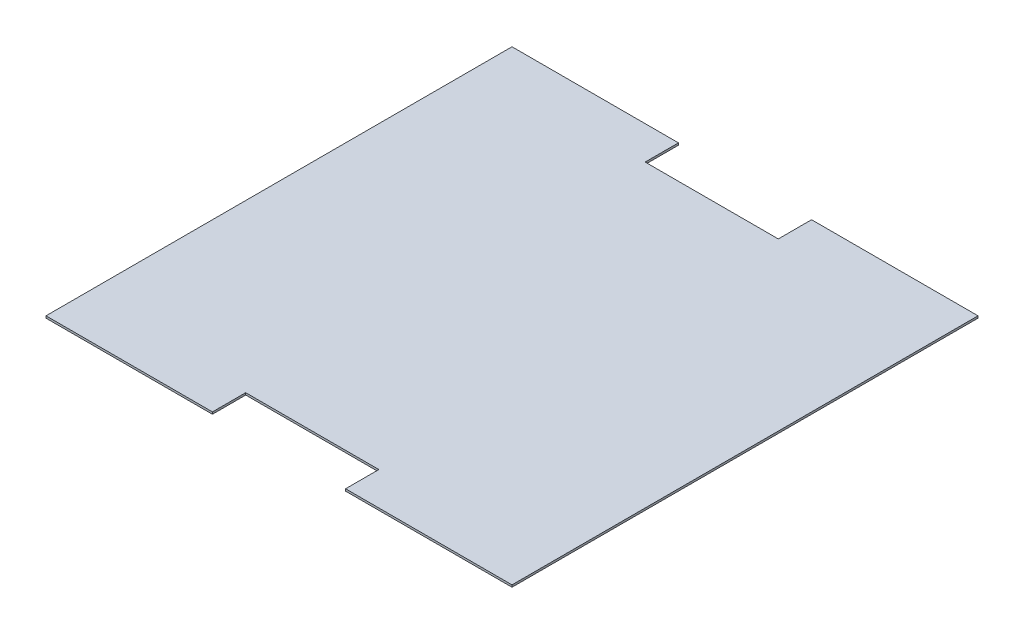
ISO-10303-21;
HEADER;
FILE_DESCRIPTION(('STEP AP214'),'2;1');
FILE_NAME('part.step','',(''),(''),'','','');
FILE_SCHEMA(('AUTOMOTIVE_DESIGN { 1 0 10303 214 1 1 1 1 }'));
ENDSEC;
DATA;
#1=APPLICATION_CONTEXT('core data for automotive mechanical design processes');
#2=APPLICATION_PROTOCOL_DEFINITION('international standard','automotive_design',2000,#1);
#3=PRODUCT_CONTEXT('',#1,'mechanical');
#4=PRODUCT('Part','Part','',(#3));
#5=PRODUCT_RELATED_PRODUCT_CATEGORY('part','',(#4));
#6=PRODUCT_DEFINITION_FORMATION('','',#4);
#7=PRODUCT_DEFINITION_CONTEXT('part definition',#1,'design');
#8=PRODUCT_DEFINITION('design','',#6,#7);
#9=PRODUCT_DEFINITION_SHAPE('','',#8);
#10=(LENGTH_UNIT() NAMED_UNIT(*) SI_UNIT(.MILLI.,.METRE.));
#11=(NAMED_UNIT(*) PLANE_ANGLE_UNIT() SI_UNIT($,.RADIAN.));
#12=(NAMED_UNIT(*) SI_UNIT($,.STERADIAN.) SOLID_ANGLE_UNIT());
#13=UNCERTAINTY_MEASURE_WITH_UNIT(LENGTH_MEASURE(1.E-05),#10,'distance_accuracy_value','');
#14=(GEOMETRIC_REPRESENTATION_CONTEXT(3) GLOBAL_UNCERTAINTY_ASSIGNED_CONTEXT((#13)) GLOBAL_UNIT_ASSIGNED_CONTEXT((#10,
#11,#12)) REPRESENTATION_CONTEXT('',''));
#15=CARTESIAN_POINT('',(0.,0.,0.));
#16=DIRECTION('',(0.,0.,1.));
#17=DIRECTION('',(1.,0.,0.));
#18=AXIS2_PLACEMENT_3D('',#15,#16,#17);
#19=CARTESIAN_POINT('',(337.734645702247,3.175,444.000231346008));
#20=DIRECTION('',(0.,0.,-1.));
#21=DIRECTION('',(-1.,0.,0.));
#22=AXIS2_PLACEMENT_3D('',#19,#20,#21);
#23=PLANE('',#22);
#24=DIRECTION('',(1.,0.,0.));
#25=VECTOR('',#24,1.);
#26=CARTESIAN_POINT('',(337.734645702247,0.,444.000231346008));
#27=LINE('',#26,#25);
#28=CARTESIAN_POINT('',(337.734645702247,0.,444.000231346008));
#29=VERTEX_POINT('',#28);
#30=CARTESIAN_POINT('',(591.734645702247,0.,444.000231346008));
#31=VERTEX_POINT('',#30);
#32=EDGE_CURVE('E135',#29,#31,#27,.T.);
#33=ORIENTED_EDGE('',*,*,#32,.T.);
#34=DIRECTION('',(0.,1.,0.));
#35=VECTOR('',#34,1.);
#36=CARTESIAN_POINT('',(591.734645702247,0.,444.000231346008));
#37=LINE('',#36,#35);
#38=CARTESIAN_POINT('',(591.734645702247,3.175,444.000231346008));
#39=VERTEX_POINT('',#38);
#40=EDGE_CURVE('E121',#31,#39,#37,.T.);
#41=ORIENTED_EDGE('',*,*,#40,.T.);
#42=DIRECTION('',(1.,0.,0.));
#43=VECTOR('',#42,1.);
#44=CARTESIAN_POINT('',(337.734645702247,3.175,444.000231346008));
#45=LINE('',#44,#43);
#46=CARTESIAN_POINT('',(337.734645702247,3.175,444.000231346008));
#47=VERTEX_POINT('',#46);
#48=EDGE_CURVE('E185',#47,#39,#45,.T.);
#49=ORIENTED_EDGE('',*,*,#48,.F.);
#50=DIRECTION('',(0.,-1.,0.));
#51=VECTOR('',#50,1.);
#52=CARTESIAN_POINT('',(337.734645702247,3.175,444.000231346008));
#53=LINE('',#52,#51);
#54=EDGE_CURVE('E11',#47,#29,#53,.T.);
#55=ORIENTED_EDGE('',*,*,#54,.T.);
#56=EDGE_LOOP('',(#33,#41,#49,#55));
#57=FACE_BOUND('',#56,.T.);
#58=ADVANCED_FACE('F32',(#57),#23,.F.);
#59=CARTESIAN_POINT('',(337.734645702247,3.175,-267.199768653992));
#60=DIRECTION('',(0.,0.,1.));
#61=DIRECTION('',(1.,0.,0.));
#62=AXIS2_PLACEMENT_3D('',#59,#60,#61);
#63=PLANE('',#62);
#64=DIRECTION('',(-1.,0.,0.));
#65=VECTOR('',#64,1.);
#66=CARTESIAN_POINT('',(337.734645702247,3.175,-267.199768653992));
#67=LINE('',#66,#65);
#68=CARTESIAN_POINT('',(591.734645702247,3.175,-267.199768653992));
#69=VERTEX_POINT('',#68);
#70=CARTESIAN_POINT('',(337.734645702247,3.175,-267.199768653992));
#71=VERTEX_POINT('',#70);
#72=EDGE_CURVE('E182',#69,#71,#67,.T.);
#73=ORIENTED_EDGE('',*,*,#72,.F.);
#74=DIRECTION('',(0.,1.,0.));
#75=VECTOR('',#74,1.);
#76=CARTESIAN_POINT('',(591.734645702247,0.,-267.199768653992));
#77=LINE('',#76,#75);
#78=CARTESIAN_POINT('',(591.734645702247,0.,-267.199768653992));
#79=VERTEX_POINT('',#78);
#80=EDGE_CURVE('E195',#79,#69,#77,.T.);
#81=ORIENTED_EDGE('',*,*,#80,.F.);
#82=DIRECTION('',(-1.,0.,0.));
#83=VECTOR('',#82,1.);
#84=CARTESIAN_POINT('',(337.734645702247,0.,-267.199768653992));
#85=LINE('',#84,#83);
#86=CARTESIAN_POINT('',(337.734645702247,0.,-267.199768653992));
#87=VERTEX_POINT('',#86);
#88=EDGE_CURVE('E145',#79,#87,#85,.T.);
#89=ORIENTED_EDGE('',*,*,#88,.T.);
#90=DIRECTION('',(0.,-1.,0.));
#91=VECTOR('',#90,1.);
#92=CARTESIAN_POINT('',(337.734645702247,3.175,-267.199768653992));
#93=LINE('',#92,#91);
#94=EDGE_CURVE('E155',#71,#87,#93,.T.);
#95=ORIENTED_EDGE('',*,*,#94,.F.);
#96=EDGE_LOOP('',(#73,#81,#89,#95));
#97=FACE_BOUND('',#96,.T.);
#98=ADVANCED_FACE('F241',(#97),#63,.F.);
#99=CARTESIAN_POINT('',(337.734645702247,3.175,-267.199768653992));
#100=DIRECTION('',(1.,0.,0.));
#101=DIRECTION('',(0.,0.,-1.));
#102=AXIS2_PLACEMENT_3D('',#99,#100,#101);
#103=PLANE('',#102);
#104=DIRECTION('',(0.,0.,1.));
#105=VECTOR('',#104,1.);
#106=CARTESIAN_POINT('',(337.734645702247,0.,-267.199768653992));
#107=LINE('',#106,#105);
#108=EDGE_CURVE('E147',#87,#29,#107,.T.);
#109=ORIENTED_EDGE('',*,*,#108,.T.);
#110=ORIENTED_EDGE('',*,*,#54,.F.);
#111=DIRECTION('',(0.,0.,1.));
#112=VECTOR('',#111,1.);
#113=CARTESIAN_POINT('',(337.734645702247,3.175,-267.199768653992));
#114=LINE('',#113,#112);
#115=EDGE_CURVE('E154',#71,#47,#114,.T.);
#116=ORIENTED_EDGE('',*,*,#115,.F.);
#117=ORIENTED_EDGE('',*,*,#94,.T.);
#118=EDGE_LOOP('',(#109,#110,#116,#117));
#119=FACE_BOUND('',#118,.T.);
#120=ADVANCED_FACE('F34',(#119),#103,.F.);
#121=CARTESIAN_POINT('',(794.934645702247,3.175,444.000231346008));
#122=VERTEX_POINT('',#121);
#123=CARTESIAN_POINT('',(1048.93464570225,3.175,444.000231346008));
#124=VERTEX_POINT('',#123);
#125=EDGE_CURVE('E187',#122,#124,#45,.T.);
#126=ORIENTED_EDGE('',*,*,#125,.F.);
#127=DIRECTION('',(0.,1.,0.));
#128=VECTOR('',#127,1.);
#129=CARTESIAN_POINT('',(794.934645702247,0.,444.000231346008));
#130=LINE('',#129,#128);
#131=CARTESIAN_POINT('',(794.934645702247,0.,444.000231346008));
#132=VERTEX_POINT('',#131);
#133=EDGE_CURVE('E130',#132,#122,#130,.T.);
#134=ORIENTED_EDGE('',*,*,#133,.F.);
#135=CARTESIAN_POINT('',(1048.93464570225,0.,444.000231346008));
#136=VERTEX_POINT('',#135);
#137=EDGE_CURVE('E143',#132,#136,#27,.T.);
#138=ORIENTED_EDGE('',*,*,#137,.T.);
#139=DIRECTION('',(0.,-1.,0.));
#140=VECTOR('',#139,1.);
#141=CARTESIAN_POINT('',(1048.93464570225,3.175,444.000231346008));
#142=LINE('',#141,#140);
#143=EDGE_CURVE('E40',#124,#136,#142,.T.);
#144=ORIENTED_EDGE('',*,*,#143,.F.);
#145=EDGE_LOOP('',(#126,#134,#138,#144));
#146=FACE_BOUND('',#145,.T.);
#147=ADVANCED_FACE('F227',(#146),#23,.F.);
#148=CARTESIAN_POINT('',(1048.93464570225,3.175,-267.199768653992));
#149=DIRECTION('',(-1.,0.,0.));
#150=DIRECTION('',(0.,0.,1.));
#151=AXIS2_PLACEMENT_3D('',#148,#149,#150);
#152=PLANE('',#151);
#153=DIRECTION('',(0.,0.,-1.));
#154=VECTOR('',#153,1.);
#155=CARTESIAN_POINT('',(1048.93464570225,0.,-267.199768653992));
#156=LINE('',#155,#154);
#157=CARTESIAN_POINT('',(1048.93464570225,0.,-267.199768653992));
#158=VERTEX_POINT('',#157);
#159=EDGE_CURVE('E142',#136,#158,#156,.T.);
#160=ORIENTED_EDGE('',*,*,#159,.T.);
#161=DIRECTION('',(0.,-1.,0.));
#162=VECTOR('',#161,1.);
#163=CARTESIAN_POINT('',(1048.93464570225,3.175,-267.199768653992));
#164=LINE('',#163,#162);
#165=CARTESIAN_POINT('',(1048.93464570225,3.175,-267.199768653992));
#166=VERTEX_POINT('',#165);
#167=EDGE_CURVE('E158',#166,#158,#164,.T.);
#168=ORIENTED_EDGE('',*,*,#167,.F.);
#169=DIRECTION('',(0.,0.,-1.));
#170=VECTOR('',#169,1.);
#171=CARTESIAN_POINT('',(1048.93464570225,3.175,-267.199768653992));
#172=LINE('',#171,#170);
#173=EDGE_CURVE('E168',#124,#166,#172,.T.);
#174=ORIENTED_EDGE('',*,*,#173,.F.);
#175=ORIENTED_EDGE('',*,*,#143,.T.);
#176=EDGE_LOOP('',(#160,#168,#174,#175));
#177=FACE_BOUND('',#176,.T.);
#178=ADVANCED_FACE('F166',(#177),#152,.F.);
#179=CARTESIAN_POINT('',(794.934645702247,0.,-267.199768653992));
#180=VERTEX_POINT('',#179);
#181=EDGE_CURVE('E151',#158,#180,#85,.T.);
#182=ORIENTED_EDGE('',*,*,#181,.T.);
#183=DIRECTION('',(0.,1.,0.));
#184=VECTOR('',#183,1.);
#185=CARTESIAN_POINT('',(794.934645702247,0.,-267.199768653992));
#186=LINE('',#185,#184);
#187=CARTESIAN_POINT('',(794.934645702247,3.175,-267.199768653992));
#188=VERTEX_POINT('',#187);
#189=EDGE_CURVE('E178',#180,#188,#186,.T.);
#190=ORIENTED_EDGE('',*,*,#189,.T.);
#191=EDGE_CURVE('E159',#166,#188,#67,.T.);
#192=ORIENTED_EDGE('',*,*,#191,.F.);
#193=ORIENTED_EDGE('',*,*,#167,.T.);
#194=EDGE_LOOP('',(#182,#190,#192,#193));
#195=FACE_BOUND('',#194,.T.);
#196=ADVANCED_FACE('F176',(#195),#63,.F.);
#197=CARTESIAN_POINT('',(0.,3.175,0.));
#198=DIRECTION('',(0.,1.,0.));
#199=DIRECTION('',(0.,0.,1.));
#200=AXIS2_PLACEMENT_3D('',#197,#198,#199);
#201=PLANE('',#200);
#202=DIRECTION('',(0.,0.,1.));
#203=VECTOR('',#202,1.);
#204=CARTESIAN_POINT('',(591.734645702247,3.175,444.000231346008));
#205=LINE('',#204,#203);
#206=CARTESIAN_POINT('',(591.734645702247,3.175,393.200231346008));
#207=VERTEX_POINT('',#206);
#208=EDGE_CURVE('E126',#207,#39,#205,.T.);
#209=ORIENTED_EDGE('',*,*,#208,.F.);
#210=DIRECTION('',(-1.,0.,0.));
#211=VECTOR('',#210,1.);
#212=CARTESIAN_POINT('',(591.734645702247,3.175,393.200231346008));
#213=LINE('',#212,#211);
#214=CARTESIAN_POINT('',(794.934645702247,3.175,393.200231346008));
#215=VERTEX_POINT('',#214);
#216=EDGE_CURVE('E138',#215,#207,#213,.T.);
#217=ORIENTED_EDGE('',*,*,#216,.F.);
#218=DIRECTION('',(0.,0.,-1.));
#219=VECTOR('',#218,1.);
#220=CARTESIAN_POINT('',(794.934645702247,3.175,444.000231346008));
#221=LINE('',#220,#219);
#222=EDGE_CURVE('E218',#122,#215,#221,.T.);
#223=ORIENTED_EDGE('',*,*,#222,.F.);
#224=ORIENTED_EDGE('',*,*,#125,.T.);
#225=ORIENTED_EDGE('',*,*,#173,.T.);
#226=ORIENTED_EDGE('',*,*,#191,.T.);
#227=DIRECTION('',(0.,0.,-1.));
#228=VECTOR('',#227,1.);
#229=CARTESIAN_POINT('',(794.934645702247,3.175,-267.199768653992));
#230=LINE('',#229,#228);
#231=CARTESIAN_POINT('',(794.934645702247,3.175,-216.399768653992));
#232=VERTEX_POINT('',#231);
#233=EDGE_CURVE('E197',#232,#188,#230,.T.);
#234=ORIENTED_EDGE('',*,*,#233,.F.);
#235=DIRECTION('',(1.,0.,0.));
#236=VECTOR('',#235,1.);
#237=CARTESIAN_POINT('',(591.734645702247,3.175,-216.399768653992));
#238=LINE('',#237,#236);
#239=CARTESIAN_POINT('',(591.734645702247,3.175,-216.399768653992));
#240=VERTEX_POINT('',#239);
#241=EDGE_CURVE('E200',#240,#232,#238,.T.);
#242=ORIENTED_EDGE('',*,*,#241,.F.);
#243=DIRECTION('',(0.,0.,1.));
#244=VECTOR('',#243,1.);
#245=CARTESIAN_POINT('',(591.734645702247,3.175,-267.199768653992));
#246=LINE('',#245,#244);
#247=EDGE_CURVE('E203',#69,#240,#246,.T.);
#248=ORIENTED_EDGE('',*,*,#247,.F.);
#249=ORIENTED_EDGE('',*,*,#72,.T.);
#250=ORIENTED_EDGE('',*,*,#115,.T.);
#251=ORIENTED_EDGE('',*,*,#48,.T.);
#252=EDGE_LOOP('',(#209,#217,#223,#224,#225,#226,#234,#242,#248,#249,#250,#251));
#253=FACE_BOUND('',#252,.T.);
#254=ADVANCED_FACE('F228',(#253),#201,.T.);
#255=CARTESIAN_POINT('',(0.,0.,0.));
#256=DIRECTION('',(0.,1.,0.));
#257=DIRECTION('',(0.,0.,1.));
#258=AXIS2_PLACEMENT_3D('',#255,#256,#257);
#259=PLANE('',#258);
#260=DIRECTION('',(-1.,0.,0.));
#261=VECTOR('',#260,1.);
#262=CARTESIAN_POINT('',(591.734645702247,0.,393.200231346008));
#263=LINE('',#262,#261);
#264=CARTESIAN_POINT('',(794.934645702247,0.,393.200231346008));
#265=VERTEX_POINT('',#264);
#266=CARTESIAN_POINT('',(591.734645702247,0.,393.200231346008));
#267=VERTEX_POINT('',#266);
#268=EDGE_CURVE('E47',#265,#267,#263,.T.);
#269=ORIENTED_EDGE('',*,*,#268,.T.);
#270=DIRECTION('',(0.,0.,1.));
#271=VECTOR('',#270,1.);
#272=CARTESIAN_POINT('',(591.734645702247,0.,444.000231346008));
#273=LINE('',#272,#271);
#274=EDGE_CURVE('E124',#267,#31,#273,.T.);
#275=ORIENTED_EDGE('',*,*,#274,.T.);
#276=ORIENTED_EDGE('',*,*,#32,.F.);
#277=ORIENTED_EDGE('',*,*,#108,.F.);
#278=ORIENTED_EDGE('',*,*,#88,.F.);
#279=DIRECTION('',(0.,0.,1.));
#280=VECTOR('',#279,1.);
#281=CARTESIAN_POINT('',(591.734645702247,0.,-267.199768653992));
#282=LINE('',#281,#280);
#283=CARTESIAN_POINT('',(591.734645702247,0.,-216.399768653992));
#284=VERTEX_POINT('',#283);
#285=EDGE_CURVE('E199',#79,#284,#282,.T.);
#286=ORIENTED_EDGE('',*,*,#285,.T.);
#287=DIRECTION('',(1.,0.,0.));
#288=VECTOR('',#287,1.);
#289=CARTESIAN_POINT('',(591.734645702247,0.,-216.399768653992));
#290=LINE('',#289,#288);
#291=CARTESIAN_POINT('',(794.934645702247,0.,-216.399768653992));
#292=VERTEX_POINT('',#291);
#293=EDGE_CURVE('E208',#284,#292,#290,.T.);
#294=ORIENTED_EDGE('',*,*,#293,.T.);
#295=DIRECTION('',(0.,0.,-1.));
#296=VECTOR('',#295,1.);
#297=CARTESIAN_POINT('',(794.934645702247,0.,-267.199768653992));
#298=LINE('',#297,#296);
#299=EDGE_CURVE('E55',#292,#180,#298,.T.);
#300=ORIENTED_EDGE('',*,*,#299,.T.);
#301=ORIENTED_EDGE('',*,*,#181,.F.);
#302=ORIENTED_EDGE('',*,*,#159,.F.);
#303=ORIENTED_EDGE('',*,*,#137,.F.);
#304=DIRECTION('',(0.,0.,-1.));
#305=VECTOR('',#304,1.);
#306=CARTESIAN_POINT('',(794.934645702247,0.,444.000231346008));
#307=LINE('',#306,#305);
#308=EDGE_CURVE('E137',#132,#265,#307,.T.);
#309=ORIENTED_EDGE('',*,*,#308,.T.);
#310=EDGE_LOOP('',(#269,#275,#276,#277,#278,#286,#294,#300,#301,#302,#303,#309));
#311=FACE_BOUND('',#310,.T.);
#312=ADVANCED_FACE('F133',(#311),#259,.F.);
#313=CARTESIAN_POINT('',(591.734645702247,0.,-267.199768653992));
#314=DIRECTION('',(-1.,0.,0.));
#315=DIRECTION('',(0.,0.,1.));
#316=AXIS2_PLACEMENT_3D('',#313,#314,#315);
#317=PLANE('',#316);
#318=ORIENTED_EDGE('',*,*,#247,.T.);
#319=DIRECTION('',(0.,1.,0.));
#320=VECTOR('',#319,1.);
#321=CARTESIAN_POINT('',(591.734645702247,0.,-216.399768653992));
#322=LINE('',#321,#320);
#323=EDGE_CURVE('E190',#284,#240,#322,.T.);
#324=ORIENTED_EDGE('',*,*,#323,.F.);
#325=ORIENTED_EDGE('',*,*,#285,.F.);
#326=ORIENTED_EDGE('',*,*,#80,.T.);
#327=EDGE_LOOP('',(#318,#324,#325,#326));
#328=FACE_BOUND('',#327,.T.);
#329=ADVANCED_FACE('F263',(#328),#317,.F.);
#330=CARTESIAN_POINT('',(794.934645702247,0.,-267.199768653992));
#331=DIRECTION('',(1.,0.,0.));
#332=DIRECTION('',(0.,0.,-1.));
#333=AXIS2_PLACEMENT_3D('',#330,#331,#332);
#334=PLANE('',#333);
#335=ORIENTED_EDGE('',*,*,#233,.T.);
#336=ORIENTED_EDGE('',*,*,#189,.F.);
#337=ORIENTED_EDGE('',*,*,#299,.F.);
#338=DIRECTION('',(0.,1.,0.));
#339=VECTOR('',#338,1.);
#340=CARTESIAN_POINT('',(794.934645702247,0.,-216.399768653992));
#341=LINE('',#340,#339);
#342=EDGE_CURVE('E192',#292,#232,#341,.T.);
#343=ORIENTED_EDGE('',*,*,#342,.T.);
#344=EDGE_LOOP('',(#335,#336,#337,#343));
#345=FACE_BOUND('',#344,.T.);
#346=ADVANCED_FACE('F267',(#345),#334,.F.);
#347=CARTESIAN_POINT('',(591.734645702247,0.,-216.399768653992));
#348=DIRECTION('',(0.,0.,1.));
#349=DIRECTION('',(1.,0.,0.));
#350=AXIS2_PLACEMENT_3D('',#347,#348,#349);
#351=PLANE('',#350);
#352=ORIENTED_EDGE('',*,*,#241,.T.);
#353=ORIENTED_EDGE('',*,*,#342,.F.);
#354=ORIENTED_EDGE('',*,*,#293,.F.);
#355=ORIENTED_EDGE('',*,*,#323,.T.);
#356=EDGE_LOOP('',(#352,#353,#354,#355));
#357=FACE_BOUND('',#356,.T.);
#358=ADVANCED_FACE('F238',(#357),#351,.F.);
#359=CARTESIAN_POINT('',(591.734645702247,0.,444.000231346008));
#360=DIRECTION('',(-1.,0.,0.));
#361=DIRECTION('',(0.,0.,1.));
#362=AXIS2_PLACEMENT_3D('',#359,#360,#361);
#363=PLANE('',#362);
#364=ORIENTED_EDGE('',*,*,#208,.T.);
#365=ORIENTED_EDGE('',*,*,#40,.F.);
#366=ORIENTED_EDGE('',*,*,#274,.F.);
#367=DIRECTION('',(0.,1.,0.));
#368=VECTOR('',#367,1.);
#369=CARTESIAN_POINT('',(591.734645702247,0.,393.200231346008));
#370=LINE('',#369,#368);
#371=EDGE_CURVE('E206',#267,#207,#370,.T.);
#372=ORIENTED_EDGE('',*,*,#371,.T.);
#373=EDGE_LOOP('',(#364,#365,#366,#372));
#374=FACE_BOUND('',#373,.T.);
#375=ADVANCED_FACE('F123',(#374),#363,.F.);
#376=CARTESIAN_POINT('',(591.734645702247,0.,393.200231346008));
#377=DIRECTION('',(0.,0.,-1.));
#378=DIRECTION('',(-1.,0.,0.));
#379=AXIS2_PLACEMENT_3D('',#376,#377,#378);
#380=PLANE('',#379);
#381=ORIENTED_EDGE('',*,*,#216,.T.);
#382=ORIENTED_EDGE('',*,*,#371,.F.);
#383=ORIENTED_EDGE('',*,*,#268,.F.);
#384=DIRECTION('',(0.,1.,0.));
#385=VECTOR('',#384,1.);
#386=CARTESIAN_POINT('',(794.934645702247,0.,393.200231346008));
#387=LINE('',#386,#385);
#388=EDGE_CURVE('E213',#265,#215,#387,.T.);
#389=ORIENTED_EDGE('',*,*,#388,.T.);
#390=EDGE_LOOP('',(#381,#382,#383,#389));
#391=FACE_BOUND('',#390,.T.);
#392=ADVANCED_FACE('F230',(#391),#380,.F.);
#393=CARTESIAN_POINT('',(794.934645702247,0.,444.000231346008));
#394=DIRECTION('',(1.,0.,0.));
#395=DIRECTION('',(0.,0.,-1.));
#396=AXIS2_PLACEMENT_3D('',#393,#394,#395);
#397=PLANE('',#396);
#398=ORIENTED_EDGE('',*,*,#222,.T.);
#399=ORIENTED_EDGE('',*,*,#388,.F.);
#400=ORIENTED_EDGE('',*,*,#308,.F.);
#401=ORIENTED_EDGE('',*,*,#133,.T.);
#402=EDGE_LOOP('',(#398,#399,#400,#401));
#403=FACE_BOUND('',#402,.T.);
#404=ADVANCED_FACE('F225',(#403),#397,.F.);
#405=CLOSED_SHELL('',(#58,#98,#120,#147,#178,#196,#254,#312,#329,#346,#358,#375,#392,#404));
#406=MANIFOLD_SOLID_BREP('B2',#405);
#407=ADVANCED_BREP_SHAPE_REPRESENTATION('',(#18,#406),#14);
#408=SHAPE_DEFINITION_REPRESENTATION(#9,#407);
ENDSEC;
END-ISO-10303-21;
